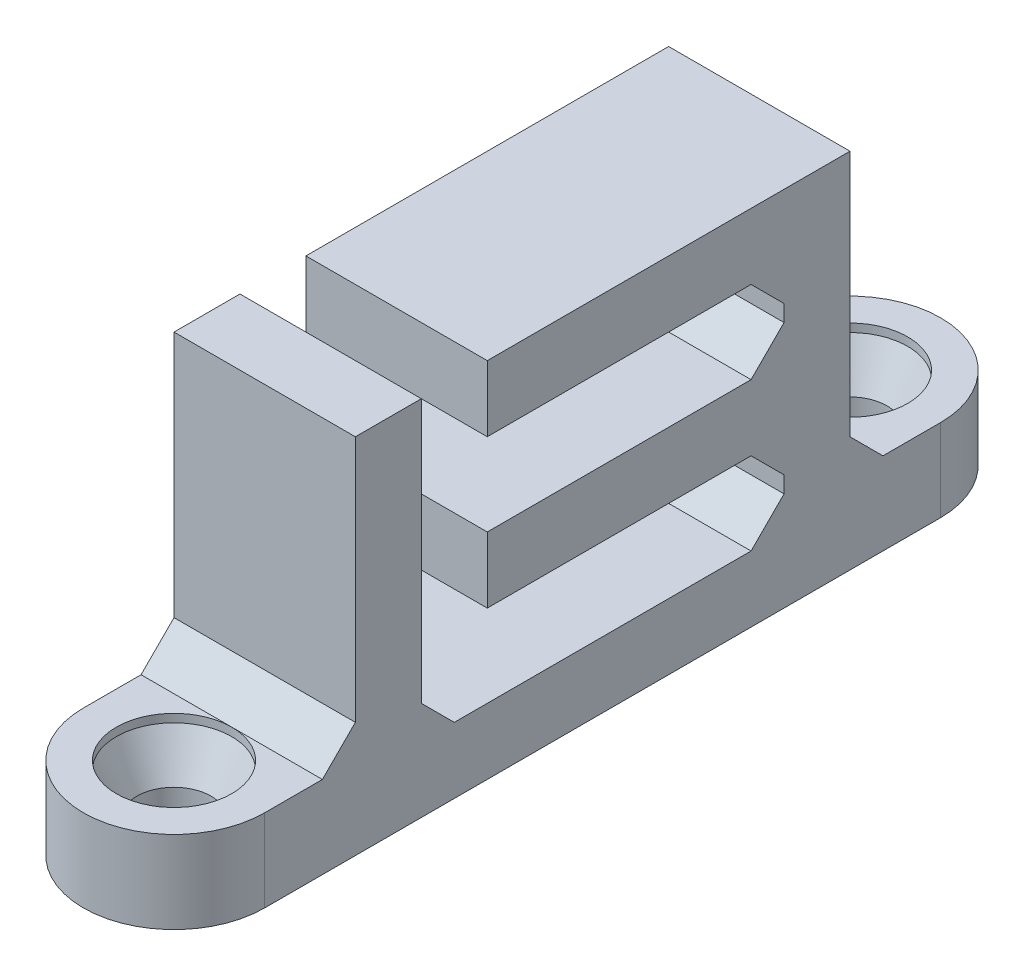
ISO-10303-21;
HEADER;
FILE_DESCRIPTION(('STEP AP214'),'2;1');
FILE_NAME('part.step','',(''),(''),'','','');
FILE_SCHEMA(('AUTOMOTIVE_DESIGN { 1 0 10303 214 1 1 1 1 }'));
ENDSEC;
DATA;
#1=APPLICATION_CONTEXT('core data for automotive mechanical design processes');
#2=APPLICATION_PROTOCOL_DEFINITION('international standard','automotive_design',2000,#1);
#3=PRODUCT_CONTEXT('',#1,'mechanical');
#4=PRODUCT('Part','Part','',(#3));
#5=PRODUCT_RELATED_PRODUCT_CATEGORY('part','',(#4));
#6=PRODUCT_DEFINITION_FORMATION('','',#4);
#7=PRODUCT_DEFINITION_CONTEXT('part definition',#1,'design');
#8=PRODUCT_DEFINITION('design','',#6,#7);
#9=PRODUCT_DEFINITION_SHAPE('','',#8);
#10=(LENGTH_UNIT() NAMED_UNIT(*) SI_UNIT(.MILLI.,.METRE.));
#11=(NAMED_UNIT(*) PLANE_ANGLE_UNIT() SI_UNIT($,.RADIAN.));
#12=(NAMED_UNIT(*) SI_UNIT($,.STERADIAN.) SOLID_ANGLE_UNIT());
#13=UNCERTAINTY_MEASURE_WITH_UNIT(LENGTH_MEASURE(1.E-05),#10,'distance_accuracy_value','');
#14=(GEOMETRIC_REPRESENTATION_CONTEXT(3) GLOBAL_UNCERTAINTY_ASSIGNED_CONTEXT((#13)) GLOBAL_UNIT_ASSIGNED_CONTEXT((#10,
#11,#12)) REPRESENTATION_CONTEXT('',''));
#15=CARTESIAN_POINT('',(0.,0.,0.));
#16=DIRECTION('',(0.,0.,1.));
#17=DIRECTION('',(1.,0.,0.));
#18=AXIS2_PLACEMENT_3D('',#15,#16,#17);
#19=CARTESIAN_POINT('',(5.5,5.,5.5));
#20=DIRECTION('',(0.,-1.,0.));
#21=DIRECTION('',(0.,0.,-1.));
#22=AXIS2_PLACEMENT_3D('',#19,#20,#21);
#23=CYLINDRICAL_SURFACE('',#22,2.25);
#24=CARTESIAN_POINT('',(5.5,0.,5.5));
#25=DIRECTION('',(0.,1.,0.));
#26=DIRECTION('',(0.,0.,1.));
#27=AXIS2_PLACEMENT_3D('',#24,#25,#26);
#28=CIRCLE('',#27,2.25);
#29=CARTESIAN_POINT('',(5.5,0.,7.75));
#30=VERTEX_POINT('',#29);
#31=EDGE_CURVE('E411',#30,#30,#28,.T.);
#32=ORIENTED_EDGE('',*,*,#31,.F.);
#33=EDGE_LOOP('',(#32));
#34=FACE_BOUND('',#33,.T.);
#35=CARTESIAN_POINT('',(5.5,2.,5.5));
#36=DIRECTION('',(0.,1.,0.));
#37=DIRECTION('',(0.,0.,1.));
#38=AXIS2_PLACEMENT_3D('',#35,#36,#37);
#39=CIRCLE('',#38,2.25);
#40=CARTESIAN_POINT('',(5.5,2.,7.75));
#41=VERTEX_POINT('',#40);
#42=EDGE_CURVE('E271',#41,#41,#39,.T.);
#43=ORIENTED_EDGE('',*,*,#42,.T.);
#44=EDGE_LOOP('',(#43));
#45=FACE_BOUND('',#44,.T.);
#46=ADVANCED_FACE('F37',(#34,#45),#23,.F.);
#47=CARTESIAN_POINT('',(5.5,5.,-35.5));
#48=DIRECTION('',(0.,-1.,0.));
#49=DIRECTION('',(0.,0.,-1.));
#50=AXIS2_PLACEMENT_3D('',#47,#48,#49);
#51=CYLINDRICAL_SURFACE('',#50,2.25);
#52=CARTESIAN_POINT('',(5.5,0.,-35.5));
#53=DIRECTION('',(0.,1.,0.));
#54=DIRECTION('',(0.,0.,1.));
#55=AXIS2_PLACEMENT_3D('',#52,#53,#54);
#56=CIRCLE('',#55,2.25);
#57=CARTESIAN_POINT('',(5.5,0.,-33.25));
#58=VERTEX_POINT('',#57);
#59=EDGE_CURVE('E275',#58,#58,#56,.T.);
#60=ORIENTED_EDGE('',*,*,#59,.F.);
#61=EDGE_LOOP('',(#60));
#62=FACE_BOUND('',#61,.T.);
#63=CARTESIAN_POINT('',(5.5,2.,-35.5));
#64=DIRECTION('',(0.,1.,0.));
#65=DIRECTION('',(0.,0.,1.));
#66=AXIS2_PLACEMENT_3D('',#63,#64,#65);
#67=CIRCLE('',#66,2.25);
#68=CARTESIAN_POINT('',(5.5,2.,-33.25));
#69=VERTEX_POINT('',#68);
#70=EDGE_CURVE('E268',#69,#69,#67,.T.);
#71=ORIENTED_EDGE('',*,*,#70,.T.);
#72=EDGE_LOOP('',(#71));
#73=FACE_BOUND('',#72,.T.);
#74=ADVANCED_FACE('F503',(#62,#73),#51,.F.);
#75=CARTESIAN_POINT('',(11.,0.,-30.));
#76=DIRECTION('',(0.,0.,1.));
#77=DIRECTION('',(1.,0.,0.));
#78=AXIS2_PLACEMENT_3D('',#75,#76,#77);
#79=PLANE('',#78);
#80=DIRECTION('',(0.,1.,0.));
#81=VECTOR('',#80,1.);
#82=CARTESIAN_POINT('',(0.,0.,-30.));
#83=LINE('',#82,#81);
#84=CARTESIAN_POINT('',(0.,7.,-30.));
#85=VERTEX_POINT('',#84);
#86=CARTESIAN_POINT('',(0.,22.,-30.));
#87=VERTEX_POINT('',#86);
#88=EDGE_CURVE('E216',#85,#87,#83,.T.);
#89=ORIENTED_EDGE('',*,*,#88,.T.);
#90=DIRECTION('',(1.,0.,0.));
#91=VECTOR('',#90,1.);
#92=CARTESIAN_POINT('',(11.,22.,-30.));
#93=LINE('',#92,#91);
#94=CARTESIAN_POINT('',(11.,22.,-30.));
#95=VERTEX_POINT('',#94);
#96=EDGE_CURVE('E226',#87,#95,#93,.T.);
#97=ORIENTED_EDGE('',*,*,#96,.T.);
#98=DIRECTION('',(0.,1.,0.));
#99=VECTOR('',#98,1.);
#100=CARTESIAN_POINT('',(11.,0.,-30.));
#101=LINE('',#100,#99);
#102=CARTESIAN_POINT('',(11.,7.,-30.));
#103=VERTEX_POINT('',#102);
#104=EDGE_CURVE('E381',#103,#95,#101,.T.);
#105=ORIENTED_EDGE('',*,*,#104,.F.);
#106=DIRECTION('',(-1.,0.,0.));
#107=VECTOR('',#106,1.);
#108=CARTESIAN_POINT('',(11.,7.,-30.));
#109=LINE('',#108,#107);
#110=EDGE_CURVE('E237',#103,#85,#109,.T.);
#111=ORIENTED_EDGE('',*,*,#110,.T.);
#112=EDGE_LOOP('',(#89,#97,#105,#111));
#113=FACE_BOUND('',#112,.T.);
#114=ADVANCED_FACE('F235',(#113),#79,.F.);
#115=CARTESIAN_POINT('',(11.,9.,0.));
#116=DIRECTION('',(0.,1.,0.));
#117=DIRECTION('',(0.,0.,1.));
#118=AXIS2_PLACEMENT_3D('',#115,#116,#117);
#119=PLANE('',#118);
#120=DIRECTION('',(0.,0.,-1.));
#121=VECTOR('',#120,1.);
#122=CARTESIAN_POINT('',(0.,9.,0.));
#123=LINE('',#122,#121);
#124=CARTESIAN_POINT('',(0.,9.,-8.));
#125=VERTEX_POINT('',#124);
#126=CARTESIAN_POINT('',(0.,9.,-24.));
#127=VERTEX_POINT('',#126);
#128=EDGE_CURVE('E253',#125,#127,#123,.T.);
#129=ORIENTED_EDGE('',*,*,#128,.T.);
#130=DIRECTION('',(1.,0.,0.));
#131=VECTOR('',#130,1.);
#132=CARTESIAN_POINT('',(11.,9.,-24.));
#133=LINE('',#132,#131);
#134=CARTESIAN_POINT('',(11.,9.,-24.));
#135=VERTEX_POINT('',#134);
#136=EDGE_CURVE('E307',#127,#135,#133,.T.);
#137=ORIENTED_EDGE('',*,*,#136,.T.);
#138=DIRECTION('',(0.,0.,-1.));
#139=VECTOR('',#138,1.);
#140=CARTESIAN_POINT('',(11.,9.,0.));
#141=LINE('',#140,#139);
#142=CARTESIAN_POINT('',(11.,9.,-8.));
#143=VERTEX_POINT('',#142);
#144=EDGE_CURVE('E363',#143,#135,#141,.T.);
#145=ORIENTED_EDGE('',*,*,#144,.F.);
#146=DIRECTION('',(-1.,0.,0.));
#147=VECTOR('',#146,1.);
#148=CARTESIAN_POINT('',(11.,9.,-8.));
#149=LINE('',#148,#147);
#150=EDGE_CURVE('E223',#143,#125,#149,.T.);
#151=ORIENTED_EDGE('',*,*,#150,.T.);
#152=EDGE_LOOP('',(#129,#137,#145,#151));
#153=FACE_BOUND('',#152,.T.);
#154=ADVANCED_FACE('F536',(#153),#119,.F.);
#155=CARTESIAN_POINT('',(11.,0.,-26.));
#156=DIRECTION('',(0.,0.,1.));
#157=DIRECTION('',(0.,-1.,0.));
#158=AXIS2_PLACEMENT_3D('',#155,#156,#157);
#159=PLANE('',#158);
#160=DIRECTION('',(0.,1.,0.));
#161=VECTOR('',#160,1.);
#162=CARTESIAN_POINT('',(11.,0.,-26.));
#163=LINE('',#162,#161);
#164=CARTESIAN_POINT('',(11.,5.99999999999999,-26.));
#165=VERTEX_POINT('',#164);
#166=CARTESIAN_POINT('',(11.,7.,-26.));
#167=VERTEX_POINT('',#166);
#168=EDGE_CURVE('E359',#165,#167,#163,.T.);
#169=ORIENTED_EDGE('',*,*,#168,.T.);
#170=DIRECTION('',(-1.,0.,0.));
#171=VECTOR('',#170,1.);
#172=CARTESIAN_POINT('',(11.,7.,-26.));
#173=LINE('',#172,#171);
#174=CARTESIAN_POINT('',(0.,7.,-26.));
#175=VERTEX_POINT('',#174);
#176=EDGE_CURVE('E304',#167,#175,#173,.T.);
#177=ORIENTED_EDGE('',*,*,#176,.T.);
#178=DIRECTION('',(0.,1.,0.));
#179=VECTOR('',#178,1.);
#180=CARTESIAN_POINT('',(0.,0.,-26.));
#181=LINE('',#180,#179);
#182=CARTESIAN_POINT('',(0.,5.99999999999999,-26.));
#183=VERTEX_POINT('',#182);
#184=EDGE_CURVE('E256',#183,#175,#181,.T.);
#185=ORIENTED_EDGE('',*,*,#184,.F.);
#186=DIRECTION('',(1.,0.,0.));
#187=VECTOR('',#186,1.);
#188=CARTESIAN_POINT('',(11.,5.99999999999999,-26.));
#189=LINE('',#188,#187);
#190=EDGE_CURVE('E302',#183,#165,#189,.T.);
#191=ORIENTED_EDGE('',*,*,#190,.T.);
#192=EDGE_LOOP('',(#169,#177,#185,#191));
#193=FACE_BOUND('',#192,.T.);
#194=ADVANCED_FACE('F349',(#193),#159,.T.);
#195=CARTESIAN_POINT('',(11.,4.,0.));
#196=DIRECTION('',(0.,1.,0.));
#197=DIRECTION('',(0.,0.,1.));
#198=AXIS2_PLACEMENT_3D('',#195,#196,#197);
#199=PLANE('',#198);
#200=DIRECTION('',(0.,0.,-1.));
#201=VECTOR('',#200,1.);
#202=CARTESIAN_POINT('',(0.,4.,0.));
#203=LINE('',#202,#201);
#204=CARTESIAN_POINT('',(0.,4.,-6.));
#205=VERTEX_POINT('',#204);
#206=CARTESIAN_POINT('',(0.,4.,-24.));
#207=VERTEX_POINT('',#206);
#208=EDGE_CURVE('E259',#205,#207,#203,.T.);
#209=ORIENTED_EDGE('',*,*,#208,.F.);
#210=DIRECTION('',(1.,0.,0.));
#211=VECTOR('',#210,1.);
#212=CARTESIAN_POINT('',(11.,4.,-6.));
#213=LINE('',#212,#211);
#214=CARTESIAN_POINT('',(11.,4.,-6.));
#215=VERTEX_POINT('',#214);
#216=EDGE_CURVE('E287',#205,#215,#213,.T.);
#217=ORIENTED_EDGE('',*,*,#216,.T.);
#218=DIRECTION('',(0.,0.,-1.));
#219=VECTOR('',#218,1.);
#220=CARTESIAN_POINT('',(11.,4.,0.));
#221=LINE('',#220,#219);
#222=CARTESIAN_POINT('',(11.,4.,-24.));
#223=VERTEX_POINT('',#222);
#224=EDGE_CURVE('E357',#215,#223,#221,.T.);
#225=ORIENTED_EDGE('',*,*,#224,.T.);
#226=DIRECTION('',(-1.,0.,0.));
#227=VECTOR('',#226,1.);
#228=CARTESIAN_POINT('',(0.,4.,-24.));
#229=LINE('',#228,#227);
#230=EDGE_CURVE('E284',#223,#207,#229,.T.);
#231=ORIENTED_EDGE('',*,*,#230,.T.);
#232=EDGE_LOOP('',(#209,#217,#225,#231));
#233=FACE_BOUND('',#232,.T.);
#234=ADVANCED_FACE('F361',(#233),#199,.T.);
#235=CARTESIAN_POINT('',(11.,18.,0.));
#236=DIRECTION('',(0.,1.,0.));
#237=DIRECTION('',(0.,0.,1.));
#238=AXIS2_PLACEMENT_3D('',#235,#236,#237);
#239=PLANE('',#238);
#240=DIRECTION('',(0.,0.,-1.));
#241=VECTOR('',#240,1.);
#242=CARTESIAN_POINT('',(0.,18.,0.));
#243=LINE('',#242,#241);
#244=CARTESIAN_POINT('',(0.,18.,-8.));
#245=VERTEX_POINT('',#244);
#246=CARTESIAN_POINT('',(0.,18.,-24.));
#247=VERTEX_POINT('',#246);
#248=EDGE_CURVE('E245',#245,#247,#243,.T.);
#249=ORIENTED_EDGE('',*,*,#248,.T.);
#250=DIRECTION('',(1.,0.,0.));
#251=VECTOR('',#250,1.);
#252=CARTESIAN_POINT('',(11.,18.,-24.));
#253=LINE('',#252,#251);
#254=CARTESIAN_POINT('',(11.,18.,-24.));
#255=VERTEX_POINT('',#254);
#256=EDGE_CURVE('E314',#247,#255,#253,.T.);
#257=ORIENTED_EDGE('',*,*,#256,.T.);
#258=DIRECTION('',(0.,0.,-1.));
#259=VECTOR('',#258,1.);
#260=CARTESIAN_POINT('',(11.,18.,0.));
#261=LINE('',#260,#259);
#262=CARTESIAN_POINT('',(11.,18.,-8.));
#263=VERTEX_POINT('',#262);
#264=EDGE_CURVE('E373',#263,#255,#261,.T.);
#265=ORIENTED_EDGE('',*,*,#264,.F.);
#266=DIRECTION('',(-1.,0.,0.));
#267=VECTOR('',#266,1.);
#268=CARTESIAN_POINT('',(11.,18.,-8.));
#269=LINE('',#268,#267);
#270=EDGE_CURVE('E388',#263,#245,#269,.T.);
#271=ORIENTED_EDGE('',*,*,#270,.T.);
#272=EDGE_LOOP('',(#249,#257,#265,#271));
#273=FACE_BOUND('',#272,.T.);
#274=ADVANCED_FACE('F533',(#273),#239,.F.);
#275=CARTESIAN_POINT('',(11.,0.,-26.));
#276=DIRECTION('',(0.,0.,1.));
#277=DIRECTION('',(0.,-1.,0.));
#278=AXIS2_PLACEMENT_3D('',#275,#276,#277);
#279=PLANE('',#278);
#280=DIRECTION('',(0.,1.,0.));
#281=VECTOR('',#280,1.);
#282=CARTESIAN_POINT('',(11.,0.,-26.));
#283=LINE('',#282,#281);
#284=CARTESIAN_POINT('',(11.,15.,-26.));
#285=VERTEX_POINT('',#284);
#286=CARTESIAN_POINT('',(11.,16.,-26.));
#287=VERTEX_POINT('',#286);
#288=EDGE_CURVE('E370',#285,#287,#283,.T.);
#289=ORIENTED_EDGE('',*,*,#288,.T.);
#290=DIRECTION('',(-1.,0.,0.));
#291=VECTOR('',#290,1.);
#292=CARTESIAN_POINT('',(11.,16.,-26.));
#293=LINE('',#292,#291);
#294=CARTESIAN_POINT('',(0.,16.,-26.));
#295=VERTEX_POINT('',#294);
#296=EDGE_CURVE('E311',#287,#295,#293,.T.);
#297=ORIENTED_EDGE('',*,*,#296,.T.);
#298=DIRECTION('',(0.,1.,0.));
#299=VECTOR('',#298,1.);
#300=CARTESIAN_POINT('',(0.,0.,-26.));
#301=LINE('',#300,#299);
#302=CARTESIAN_POINT('',(0.,15.,-26.));
#303=VERTEX_POINT('',#302);
#304=EDGE_CURVE('E248',#303,#295,#301,.T.);
#305=ORIENTED_EDGE('',*,*,#304,.F.);
#306=DIRECTION('',(1.,0.,0.));
#307=VECTOR('',#306,1.);
#308=CARTESIAN_POINT('',(11.,15.,-26.));
#309=LINE('',#308,#307);
#310=EDGE_CURVE('E309',#303,#285,#309,.T.);
#311=ORIENTED_EDGE('',*,*,#310,.T.);
#312=EDGE_LOOP('',(#289,#297,#305,#311));
#313=FACE_BOUND('',#312,.T.);
#314=ADVANCED_FACE('F543',(#313),#279,.T.);
#315=CARTESIAN_POINT('',(11.,13.,0.));
#316=DIRECTION('',(0.,-1.,0.));
#317=DIRECTION('',(0.,0.,-1.));
#318=AXIS2_PLACEMENT_3D('',#315,#316,#317);
#319=PLANE('',#318);
#320=DIRECTION('',(0.,0.,1.));
#321=VECTOR('',#320,1.);
#322=CARTESIAN_POINT('',(11.,13.,0.));
#323=LINE('',#322,#321);
#324=CARTESIAN_POINT('',(11.,13.,-24.));
#325=VERTEX_POINT('',#324);
#326=CARTESIAN_POINT('',(11.,13.,-8.));
#327=VERTEX_POINT('',#326);
#328=EDGE_CURVE('E368',#325,#327,#323,.T.);
#329=ORIENTED_EDGE('',*,*,#328,.F.);
#330=DIRECTION('',(-1.,0.,0.));
#331=VECTOR('',#330,1.);
#332=CARTESIAN_POINT('',(11.,13.,-24.));
#333=LINE('',#332,#331);
#334=CARTESIAN_POINT('',(0.,13.,-24.));
#335=VERTEX_POINT('',#334);
#336=EDGE_CURVE('E316',#325,#335,#333,.T.);
#337=ORIENTED_EDGE('',*,*,#336,.T.);
#338=DIRECTION('',(0.,0.,1.));
#339=VECTOR('',#338,1.);
#340=CARTESIAN_POINT('',(0.,13.,0.));
#341=LINE('',#340,#339);
#342=CARTESIAN_POINT('',(0.,13.,-8.));
#343=VERTEX_POINT('',#342);
#344=EDGE_CURVE('E251',#335,#343,#341,.T.);
#345=ORIENTED_EDGE('',*,*,#344,.T.);
#346=DIRECTION('',(1.,0.,0.));
#347=VECTOR('',#346,1.);
#348=CARTESIAN_POINT('',(11.,13.,-8.));
#349=LINE('',#348,#347);
#350=EDGE_CURVE('E391',#343,#327,#349,.T.);
#351=ORIENTED_EDGE('',*,*,#350,.T.);
#352=EDGE_LOOP('',(#329,#337,#345,#351));
#353=FACE_BOUND('',#352,.T.);
#354=ADVANCED_FACE('F540',(#353),#319,.F.);
#355=CARTESIAN_POINT('',(11.,0.,0.));
#356=DIRECTION('',(0.,0.,1.));
#357=DIRECTION('',(0.,-1.,0.));
#358=AXIS2_PLACEMENT_3D('',#355,#356,#357);
#359=PLANE('',#358);
#360=DIRECTION('',(1.,0.,0.));
#361=VECTOR('',#360,1.);
#362=CARTESIAN_POINT('',(11.,22.,0.));
#363=LINE('',#362,#361);
#364=CARTESIAN_POINT('',(0.,22.,0.));
#365=VERTEX_POINT('',#364);
#366=CARTESIAN_POINT('',(11.,22.,0.));
#367=VERTEX_POINT('',#366);
#368=EDGE_CURVE('E233',#365,#367,#363,.T.);
#369=ORIENTED_EDGE('',*,*,#368,.F.);
#370=DIRECTION('',(0.,1.,0.));
#371=VECTOR('',#370,1.);
#372=CARTESIAN_POINT('',(0.,0.,0.));
#373=LINE('',#372,#371);
#374=CARTESIAN_POINT('',(0.,6.99999999999999,0.));
#375=VERTEX_POINT('',#374);
#376=EDGE_CURVE('E238',#375,#365,#373,.T.);
#377=ORIENTED_EDGE('',*,*,#376,.F.);
#378=DIRECTION('',(1.,0.,0.));
#379=VECTOR('',#378,1.);
#380=CARTESIAN_POINT('',(11.,6.99999999999999,0.));
#381=LINE('',#380,#379);
#382=CARTESIAN_POINT('',(11.,6.99999999999999,0.));
#383=VERTEX_POINT('',#382);
#384=EDGE_CURVE('E294',#375,#383,#381,.T.);
#385=ORIENTED_EDGE('',*,*,#384,.T.);
#386=DIRECTION('',(0.,1.,0.));
#387=VECTOR('',#386,1.);
#388=CARTESIAN_POINT('',(11.,0.,0.));
#389=LINE('',#388,#387);
#390=EDGE_CURVE('E378',#383,#367,#389,.T.);
#391=ORIENTED_EDGE('',*,*,#390,.T.);
#392=EDGE_LOOP('',(#369,#377,#385,#391));
#393=FACE_BOUND('',#392,.T.);
#394=ADVANCED_FACE('F452',(#393),#359,.T.);
#395=CARTESIAN_POINT('',(11.,22.,0.));
#396=DIRECTION('',(0.,-1.,0.));
#397=DIRECTION('',(0.,0.,-1.));
#398=AXIS2_PLACEMENT_3D('',#395,#396,#397);
#399=PLANE('',#398);
#400=DIRECTION('',(0.,0.,1.));
#401=VECTOR('',#400,1.);
#402=CARTESIAN_POINT('',(11.,22.,0.));
#403=LINE('',#402,#401);
#404=CARTESIAN_POINT('',(11.,22.,-8.));
#405=VERTEX_POINT('',#404);
#406=EDGE_CURVE('E228',#95,#405,#403,.T.);
#407=ORIENTED_EDGE('',*,*,#406,.F.);
#408=ORIENTED_EDGE('',*,*,#96,.F.);
#409=DIRECTION('',(0.,0.,1.));
#410=VECTOR('',#409,1.);
#411=CARTESIAN_POINT('',(0.,22.,0.));
#412=LINE('',#411,#410);
#413=CARTESIAN_POINT('',(0.,22.,-8.));
#414=VERTEX_POINT('',#413);
#415=EDGE_CURVE('E211',#87,#414,#412,.T.);
#416=ORIENTED_EDGE('',*,*,#415,.T.);
#417=DIRECTION('',(1.,0.,0.));
#418=VECTOR('',#417,1.);
#419=CARTESIAN_POINT('',(11.,22.,-8.));
#420=LINE('',#419,#418);
#421=EDGE_CURVE('E394',#414,#405,#420,.T.);
#422=ORIENTED_EDGE('',*,*,#421,.T.);
#423=EDGE_LOOP('',(#407,#408,#416,#422));
#424=FACE_BOUND('',#423,.T.);
#425=ADVANCED_FACE('F227',(#424),#399,.F.);
#426=CARTESIAN_POINT('',(11.,0.,0.));
#427=DIRECTION('',(0.,1.,0.));
#428=DIRECTION('',(0.,0.,1.));
#429=AXIS2_PLACEMENT_3D('',#426,#427,#428);
#430=PLANE('',#429);
#431=DIRECTION('',(0.,0.,-1.));
#432=VECTOR('',#431,1.);
#433=CARTESIAN_POINT('',(0.,0.,0.));
#434=LINE('',#433,#432);
#435=CARTESIAN_POINT('',(0.,0.,5.5));
#436=VERTEX_POINT('',#435);
#437=CARTESIAN_POINT('',(0.,0.,-35.5));
#438=VERTEX_POINT('',#437);
#439=EDGE_CURVE('E240',#436,#438,#434,.T.);
#440=ORIENTED_EDGE('',*,*,#439,.T.);
#441=CARTESIAN_POINT('',(5.5,0.,-35.5));
#442=DIRECTION('',(0.,1.,0.));
#443=DIRECTION('',(0.,0.,1.));
#444=AXIS2_PLACEMENT_3D('',#441,#442,#443);
#445=CIRCLE('',#444,5.5);
#446=CARTESIAN_POINT('',(11.,0.,-35.5));
#447=VERTEX_POINT('',#446);
#448=EDGE_CURVE('E426',#447,#438,#445,.T.);
#449=ORIENTED_EDGE('',*,*,#448,.F.);
#450=DIRECTION('',(0.,0.,-1.));
#451=VECTOR('',#450,1.);
#452=CARTESIAN_POINT('',(11.,0.,0.));
#453=LINE('',#452,#451);
#454=CARTESIAN_POINT('',(11.,0.,5.5));
#455=VERTEX_POINT('',#454);
#456=EDGE_CURVE('E376',#455,#447,#453,.T.);
#457=ORIENTED_EDGE('',*,*,#456,.F.);
#458=CARTESIAN_POINT('',(5.5,0.,5.5));
#459=DIRECTION('',(0.,1.,0.));
#460=DIRECTION('',(0.,0.,1.));
#461=AXIS2_PLACEMENT_3D('',#458,#459,#460);
#462=CIRCLE('',#461,5.5);
#463=EDGE_CURVE('E407',#436,#455,#462,.T.);
#464=ORIENTED_EDGE('',*,*,#463,.F.);
#465=EDGE_LOOP('',(#440,#449,#457,#464));
#466=FACE_BOUND('',#465,.T.);
#467=ORIENTED_EDGE('',*,*,#31,.T.);
#468=EDGE_LOOP('',(#467));
#469=FACE_BOUND('',#468,.T.);
#470=ORIENTED_EDGE('',*,*,#59,.T.);
#471=EDGE_LOOP('',(#470));
#472=FACE_BOUND('',#471,.T.);
#473=ADVANCED_FACE('F478',(#466,#469,#472),#430,.F.);
#474=CARTESIAN_POINT('',(11.,0.,-4.00000000000001));
#475=DIRECTION('',(0.,0.,-1.));
#476=DIRECTION('',(0.,1.,0.));
#477=AXIS2_PLACEMENT_3D('',#474,#475,#476);
#478=PLANE('',#477);
#479=DIRECTION('',(-1.,0.,0.));
#480=VECTOR('',#479,1.);
#481=CARTESIAN_POINT('',(11.,22.,-4.00000000000001));
#482=LINE('',#481,#480);
#483=CARTESIAN_POINT('',(11.,22.,-4.));
#484=VERTEX_POINT('',#483);
#485=CARTESIAN_POINT('',(0.,22.,-4.00000000000001));
#486=VERTEX_POINT('',#485);
#487=EDGE_CURVE('E53',#484,#486,#482,.T.);
#488=ORIENTED_EDGE('',*,*,#487,.F.);
#489=DIRECTION('',(0.,-1.,0.));
#490=VECTOR('',#489,1.);
#491=CARTESIAN_POINT('',(11.,0.,-4.00000000000001));
#492=LINE('',#491,#490);
#493=CARTESIAN_POINT('',(11.,6.00000000000002,-4.00000000000001));
#494=VERTEX_POINT('',#493);
#495=EDGE_CURVE('E383',#484,#494,#492,.T.);
#496=ORIENTED_EDGE('',*,*,#495,.T.);
#497=DIRECTION('',(-1.,0.,0.));
#498=VECTOR('',#497,1.);
#499=CARTESIAN_POINT('',(0.,6.00000000000002,-4.00000000000001));
#500=LINE('',#499,#498);
#501=CARTESIAN_POINT('',(0.,6.00000000000002,-4.00000000000001));
#502=VERTEX_POINT('',#501);
#503=EDGE_CURVE('E281',#494,#502,#500,.T.);
#504=ORIENTED_EDGE('',*,*,#503,.T.);
#505=DIRECTION('',(0.,-1.,0.));
#506=VECTOR('',#505,1.);
#507=CARTESIAN_POINT('',(0.,0.,-4.00000000000001));
#508=LINE('',#507,#506);
#509=EDGE_CURVE('E262',#486,#502,#508,.T.);
#510=ORIENTED_EDGE('',*,*,#509,.F.);
#511=EDGE_LOOP('',(#488,#496,#504,#510));
#512=FACE_BOUND('',#511,.T.);
#513=ADVANCED_FACE('F525',(#512),#478,.T.);
#514=CARTESIAN_POINT('',(11.,0.,0.));
#515=DIRECTION('',(1.,0.,0.));
#516=DIRECTION('',(0.,0.,-1.));
#517=AXIS2_PLACEMENT_3D('',#514,#515,#516);
#518=PLANE('',#517);
#519=DIRECTION('',(0.,0.,1.));
#520=VECTOR('',#519,1.);
#521=CARTESIAN_POINT('',(11.,22.,-33.9659140243555));
#522=LINE('',#521,#520);
#523=EDGE_CURVE('E444',#484,#367,#522,.T.);
#524=ORIENTED_EDGE('',*,*,#523,.T.);
#525=ORIENTED_EDGE('',*,*,#390,.F.);
#526=DIRECTION('',(0.,0.707106781186543,-0.707106781186552));
#527=VECTOR('',#526,1.);
#528=CARTESIAN_POINT('',(11.,5.,2.00000000000002));
#529=LINE('',#528,#527);
#530=CARTESIAN_POINT('',(11.,5.,2.00000000000002));
#531=VERTEX_POINT('',#530);
#532=EDGE_CURVE('E326',#383,#531,#529,.F.);
#533=ORIENTED_EDGE('',*,*,#532,.T.);
#534=DIRECTION('',(0.,0.,-1.));
#535=VECTOR('',#534,1.);
#536=CARTESIAN_POINT('',(11.,5.,0.));
#537=LINE('',#536,#535);
#538=CARTESIAN_POINT('',(11.,5.,5.5));
#539=VERTEX_POINT('',#538);
#540=EDGE_CURVE('E406',#539,#531,#537,.T.);
#541=ORIENTED_EDGE('',*,*,#540,.F.);
#542=DIRECTION('',(0.,-1.,0.));
#543=VECTOR('',#542,1.);
#544=CARTESIAN_POINT('',(11.,5.,5.5));
#545=LINE('',#544,#543);
#546=EDGE_CURVE('E403',#539,#455,#545,.T.);
#547=ORIENTED_EDGE('',*,*,#546,.T.);
#548=ORIENTED_EDGE('',*,*,#456,.T.);
#549=DIRECTION('',(0.,-1.,0.));
#550=VECTOR('',#549,1.);
#551=CARTESIAN_POINT('',(11.,5.,-35.5));
#552=LINE('',#551,#550);
#553=CARTESIAN_POINT('',(11.,5.,-35.5));
#554=VERTEX_POINT('',#553);
#555=EDGE_CURVE('E422',#554,#447,#552,.T.);
#556=ORIENTED_EDGE('',*,*,#555,.F.);
#557=DIRECTION('',(0.,0.,-1.));
#558=VECTOR('',#557,1.);
#559=CARTESIAN_POINT('',(11.,5.,-35.5));
#560=LINE('',#559,#558);
#561=CARTESIAN_POINT('',(11.,5.,-32.));
#562=VERTEX_POINT('',#561);
#563=EDGE_CURVE('E425',#562,#554,#560,.T.);
#564=ORIENTED_EDGE('',*,*,#563,.F.);
#565=DIRECTION('',(0.,0.707106781186544,0.707106781186551));
#566=VECTOR('',#565,1.);
#567=CARTESIAN_POINT('',(11.,5.,-32.));
#568=LINE('',#567,#566);
#569=EDGE_CURVE('E328',#562,#103,#568,.T.);
#570=ORIENTED_EDGE('',*,*,#569,.T.);
#571=ORIENTED_EDGE('',*,*,#104,.T.);
#572=ORIENTED_EDGE('',*,*,#406,.T.);
#573=DIRECTION('',(0.,1.,0.));
#574=VECTOR('',#573,1.);
#575=CARTESIAN_POINT('',(11.,4.,-8.));
#576=LINE('',#575,#574);
#577=EDGE_CURVE('E397',#263,#405,#576,.T.);
#578=ORIENTED_EDGE('',*,*,#577,.F.);
#579=ORIENTED_EDGE('',*,*,#264,.T.);
#580=DIRECTION('',(0.,-0.707106781186551,-0.707106781186544));
#581=VECTOR('',#580,1.);
#582=CARTESIAN_POINT('',(11.,16.,-26.));
#583=LINE('',#582,#581);
#584=EDGE_CURVE('E338',#255,#287,#583,.T.);
#585=ORIENTED_EDGE('',*,*,#584,.T.);
#586=ORIENTED_EDGE('',*,*,#288,.F.);
#587=DIRECTION('',(0.,-0.707106781186545,0.70710678118655));
#588=VECTOR('',#587,1.);
#589=CARTESIAN_POINT('',(11.,13.,-24.));
#590=LINE('',#589,#588);
#591=EDGE_CURVE('E61',#285,#325,#590,.T.);
#592=ORIENTED_EDGE('',*,*,#591,.T.);
#593=ORIENTED_EDGE('',*,*,#328,.T.);
#594=EDGE_CURVE('E396',#143,#327,#576,.T.);
#595=ORIENTED_EDGE('',*,*,#594,.F.);
#596=ORIENTED_EDGE('',*,*,#144,.T.);
#597=DIRECTION('',(0.,-0.70710678118655,-0.707106781186545));
#598=VECTOR('',#597,1.);
#599=CARTESIAN_POINT('',(11.,7.,-26.));
#600=LINE('',#599,#598);
#601=EDGE_CURVE('E334',#135,#167,#600,.T.);
#602=ORIENTED_EDGE('',*,*,#601,.T.);
#603=ORIENTED_EDGE('',*,*,#168,.F.);
#604=DIRECTION('',(0.,0.707106781186545,-0.70710678118655));
#605=VECTOR('',#604,1.);
#606=CARTESIAN_POINT('',(11.,4.,-24.));
#607=LINE('',#606,#605);
#608=EDGE_CURVE('E11',#165,#223,#607,.F.);
#609=ORIENTED_EDGE('',*,*,#608,.T.);
#610=ORIENTED_EDGE('',*,*,#224,.F.);
#611=DIRECTION('',(0.,-0.707106781186551,-0.707106781186544));
#612=VECTOR('',#611,1.);
#613=CARTESIAN_POINT('',(11.,6.00000000000002,-4.00000000000001));
#614=LINE('',#613,#612);
#615=EDGE_CURVE('E321',#215,#494,#614,.F.);
#616=ORIENTED_EDGE('',*,*,#615,.T.);
#617=ORIENTED_EDGE('',*,*,#495,.F.);
#618=EDGE_LOOP('',(#524,#525,#533,#541,#547,#548,#556,#564,#570,#571,#572,#578,#579,#585,#586,
#592,#593,#595,#596,#602,#603,#609,#610,#616,#617));
#619=FACE_BOUND('',#618,.T.);
#620=ADVANCED_FACE('F356',(#619),#518,.T.);
#621=CARTESIAN_POINT('',(0.,0.,0.));
#622=DIRECTION('',(1.,0.,0.));
#623=DIRECTION('',(0.,0.,-1.));
#624=AXIS2_PLACEMENT_3D('',#621,#622,#623);
#625=PLANE('',#624);
#626=ORIENTED_EDGE('',*,*,#376,.T.);
#627=DIRECTION('',(0.,0.,1.));
#628=VECTOR('',#627,1.);
#629=CARTESIAN_POINT('',(0.,22.,-33.9659140243555));
#630=LINE('',#629,#628);
#631=EDGE_CURVE('E445',#486,#365,#630,.T.);
#632=ORIENTED_EDGE('',*,*,#631,.F.);
#633=ORIENTED_EDGE('',*,*,#509,.T.);
#634=DIRECTION('',(0.,0.707106781186551,0.707106781186544));
#635=VECTOR('',#634,1.);
#636=CARTESIAN_POINT('',(0.,4.99999999999998,-5.00000000000003));
#637=LINE('',#636,#635);
#638=EDGE_CURVE('E319',#502,#205,#637,.F.);
#639=ORIENTED_EDGE('',*,*,#638,.T.);
#640=ORIENTED_EDGE('',*,*,#208,.T.);
#641=DIRECTION('',(0.,-0.707106781186545,0.70710678118655));
#642=VECTOR('',#641,1.);
#643=CARTESIAN_POINT('',(0.,-9.99999999999998,-9.99999999999991));
#644=LINE('',#643,#642);
#645=EDGE_CURVE('E46',#207,#183,#644,.F.);
#646=ORIENTED_EDGE('',*,*,#645,.T.);
#647=ORIENTED_EDGE('',*,*,#184,.T.);
#648=DIRECTION('',(0.,0.70710678118655,0.707106781186545));
#649=VECTOR('',#648,1.);
#650=CARTESIAN_POINT('',(0.,16.5,-16.5000000000001));
#651=LINE('',#650,#649);
#652=EDGE_CURVE('E332',#175,#127,#651,.T.);
#653=ORIENTED_EDGE('',*,*,#652,.T.);
#654=ORIENTED_EDGE('',*,*,#128,.F.);
#655=DIRECTION('',(0.,1.,0.));
#656=VECTOR('',#655,1.);
#657=CARTESIAN_POINT('',(0.,0.,-8.));
#658=LINE('',#657,#656);
#659=EDGE_CURVE('E264',#125,#343,#658,.T.);
#660=ORIENTED_EDGE('',*,*,#659,.T.);
#661=ORIENTED_EDGE('',*,*,#344,.F.);
#662=DIRECTION('',(0.,0.707106781186545,-0.70710678118655));
#663=VECTOR('',#662,1.);
#664=CARTESIAN_POINT('',(0.,-5.49999999999996,-5.49999999999992));
#665=LINE('',#664,#663);
#666=EDGE_CURVE('E340',#335,#303,#665,.T.);
#667=ORIENTED_EDGE('',*,*,#666,.T.);
#668=ORIENTED_EDGE('',*,*,#304,.T.);
#669=DIRECTION('',(0.,0.707106781186551,0.707106781186544));
#670=VECTOR('',#669,1.);
#671=CARTESIAN_POINT('',(0.,20.9999999999999,-21.0000000000001));
#672=LINE('',#671,#670);
#673=EDGE_CURVE('E336',#295,#247,#672,.T.);
#674=ORIENTED_EDGE('',*,*,#673,.T.);
#675=ORIENTED_EDGE('',*,*,#248,.F.);
#676=EDGE_CURVE('E219',#245,#414,#658,.T.);
#677=ORIENTED_EDGE('',*,*,#676,.T.);
#678=ORIENTED_EDGE('',*,*,#415,.F.);
#679=ORIENTED_EDGE('',*,*,#88,.F.);
#680=DIRECTION('',(0.,-0.707106781186544,-0.707106781186551));
#681=VECTOR('',#680,1.);
#682=CARTESIAN_POINT('',(0.,18.5,-18.4999999999998));
#683=LINE('',#682,#681);
#684=CARTESIAN_POINT('',(0.,5.,-32.));
#685=VERTEX_POINT('',#684);
#686=EDGE_CURVE('E330',#85,#685,#683,.T.);
#687=ORIENTED_EDGE('',*,*,#686,.T.);
#688=DIRECTION('',(0.,0.,1.));
#689=VECTOR('',#688,1.);
#690=CARTESIAN_POINT('',(0.,5.,-30.));
#691=LINE('',#690,#689);
#692=CARTESIAN_POINT('',(0.,5.,-35.5));
#693=VERTEX_POINT('',#692);
#694=EDGE_CURVE('E431',#693,#685,#691,.T.);
#695=ORIENTED_EDGE('',*,*,#694,.F.);
#696=DIRECTION('',(0.,-1.,0.));
#697=VECTOR('',#696,1.);
#698=CARTESIAN_POINT('',(0.,5.,-35.5));
#699=LINE('',#698,#697);
#700=EDGE_CURVE('E419',#693,#438,#699,.T.);
#701=ORIENTED_EDGE('',*,*,#700,.T.);
#702=ORIENTED_EDGE('',*,*,#439,.F.);
#703=DIRECTION('',(0.,-1.,0.));
#704=VECTOR('',#703,1.);
#705=CARTESIAN_POINT('',(0.,5.,5.5));
#706=LINE('',#705,#704);
#707=CARTESIAN_POINT('',(0.,5.,5.5));
#708=VERTEX_POINT('',#707);
#709=EDGE_CURVE('E400',#708,#436,#706,.T.);
#710=ORIENTED_EDGE('',*,*,#709,.F.);
#711=DIRECTION('',(0.,0.,1.));
#712=VECTOR('',#711,1.);
#713=CARTESIAN_POINT('',(0.,5.,0.));
#714=LINE('',#713,#712);
#715=CARTESIAN_POINT('',(0.,5.,2.00000000000002));
#716=VERTEX_POINT('',#715);
#717=EDGE_CURVE('E410',#716,#708,#714,.T.);
#718=ORIENTED_EDGE('',*,*,#717,.F.);
#719=DIRECTION('',(0.,-0.707106781186543,0.707106781186552));
#720=VECTOR('',#719,1.);
#721=CARTESIAN_POINT('',(0.,3.50000000000004,3.49999999999999));
#722=LINE('',#721,#720);
#723=EDGE_CURVE('E324',#716,#375,#722,.F.);
#724=ORIENTED_EDGE('',*,*,#723,.T.);
#725=EDGE_LOOP('',(#626,#632,#633,#639,#640,#646,#647,#653,#654,#660,#661,#667,#668,#674,#675,
#677,#678,#679,#687,#695,#701,#702,#710,#718,#724));
#726=FACE_BOUND('',#725,.T.);
#727=ADVANCED_FACE('F214',(#726),#625,.F.);
#728=CARTESIAN_POINT('',(0.,4.,-8.));
#729=DIRECTION('',(0.,0.,-1.));
#730=DIRECTION('',(-1.,0.,0.));
#731=AXIS2_PLACEMENT_3D('',#728,#729,#730);
#732=PLANE('',#731);
#733=ORIENTED_EDGE('',*,*,#577,.T.);
#734=ORIENTED_EDGE('',*,*,#421,.F.);
#735=ORIENTED_EDGE('',*,*,#676,.F.);
#736=ORIENTED_EDGE('',*,*,#270,.F.);
#737=EDGE_LOOP('',(#733,#734,#735,#736));
#738=FACE_BOUND('',#737,.T.);
#739=ADVANCED_FACE('F521',(#738),#732,.F.);
#740=ORIENTED_EDGE('',*,*,#594,.T.);
#741=ORIENTED_EDGE('',*,*,#350,.F.);
#742=ORIENTED_EDGE('',*,*,#659,.F.);
#743=ORIENTED_EDGE('',*,*,#150,.F.);
#744=EDGE_LOOP('',(#740,#741,#742,#743));
#745=FACE_BOUND('',#744,.T.);
#746=ADVANCED_FACE('F516',(#745),#732,.F.);
#747=CARTESIAN_POINT('',(5.5,5.,5.5));
#748=DIRECTION('',(0.,1.,0.));
#749=DIRECTION('',(0.,0.,1.));
#750=AXIS2_PLACEMENT_3D('',#747,#748,#749);
#751=PLANE('',#750);
#752=ORIENTED_EDGE('',*,*,#540,.T.);
#753=DIRECTION('',(-1.,0.,0.));
#754=VECTOR('',#753,1.);
#755=CARTESIAN_POINT('',(0.,5.,2.00000000000002));
#756=LINE('',#755,#754);
#757=CARTESIAN_POINT('',(5.5,5.,2.00000000000002));
#758=VERTEX_POINT('',#757);
#759=EDGE_CURVE('E291',#531,#758,#756,.T.);
#760=ORIENTED_EDGE('',*,*,#759,.T.);
#761=CARTESIAN_POINT('',(5.5,5.,5.5));
#762=DIRECTION('',(0.,1.,0.));
#763=DIRECTION('',(0.,0.,1.));
#764=AXIS2_PLACEMENT_3D('',#761,#762,#763);
#765=CIRCLE('',#764,3.5);
#766=EDGE_CURVE('E272',#758,#758,#765,.T.);
#767=ORIENTED_EDGE('',*,*,#766,.F.);
#768=DIRECTION('',(-1.,0.,0.));
#769=VECTOR('',#768,1.);
#770=CARTESIAN_POINT('',(0.,5.,2.00000000000002));
#771=LINE('',#770,#769);
#772=EDGE_CURVE('E289',#758,#716,#771,.T.);
#773=ORIENTED_EDGE('',*,*,#772,.T.);
#774=ORIENTED_EDGE('',*,*,#717,.T.);
#775=CARTESIAN_POINT('',(5.5,5.,5.5));
#776=DIRECTION('',(0.,1.,0.));
#777=DIRECTION('',(0.,0.,1.));
#778=AXIS2_PLACEMENT_3D('',#775,#776,#777);
#779=CIRCLE('',#778,5.5);
#780=EDGE_CURVE('E414',#708,#539,#779,.T.);
#781=ORIENTED_EDGE('',*,*,#780,.T.);
#782=EDGE_LOOP('',(#752,#760,#767,#773,#774,#781));
#783=FACE_BOUND('',#782,.T.);
#784=ADVANCED_FACE('F461',(#783),#751,.T.);
#785=CARTESIAN_POINT('',(5.5,5.,5.5));
#786=DIRECTION('',(0.,-1.,0.));
#787=DIRECTION('',(0.,0.,-1.));
#788=AXIS2_PLACEMENT_3D('',#785,#786,#787);
#789=CYLINDRICAL_SURFACE('',#788,5.5);
#790=ORIENTED_EDGE('',*,*,#463,.T.);
#791=ORIENTED_EDGE('',*,*,#546,.F.);
#792=ORIENTED_EDGE('',*,*,#780,.F.);
#793=ORIENTED_EDGE('',*,*,#709,.T.);
#794=EDGE_LOOP('',(#790,#791,#792,#793));
#795=FACE_BOUND('',#794,.T.);
#796=ADVANCED_FACE('F468',(#795),#789,.T.);
#797=CARTESIAN_POINT('',(5.5,5.,-35.5));
#798=DIRECTION('',(0.,1.,0.));
#799=DIRECTION('',(0.,0.,1.));
#800=AXIS2_PLACEMENT_3D('',#797,#798,#799);
#801=PLANE('',#800);
#802=ORIENTED_EDGE('',*,*,#694,.T.);
#803=DIRECTION('',(1.,0.,0.));
#804=VECTOR('',#803,1.);
#805=CARTESIAN_POINT('',(5.5,5.,-32.));
#806=LINE('',#805,#804);
#807=CARTESIAN_POINT('',(5.5,5.,-32.));
#808=VERTEX_POINT('',#807);
#809=EDGE_CURVE('E298',#685,#808,#806,.T.);
#810=ORIENTED_EDGE('',*,*,#809,.T.);
#811=CARTESIAN_POINT('',(5.5,5.,-35.5));
#812=DIRECTION('',(0.,1.,0.));
#813=DIRECTION('',(0.,0.,1.));
#814=AXIS2_PLACEMENT_3D('',#811,#812,#813);
#815=CIRCLE('',#814,3.5);
#816=EDGE_CURVE('E232',#808,#808,#815,.T.);
#817=ORIENTED_EDGE('',*,*,#816,.F.);
#818=DIRECTION('',(1.,0.,0.));
#819=VECTOR('',#818,1.);
#820=CARTESIAN_POINT('',(5.5,5.,-32.));
#821=LINE('',#820,#819);
#822=EDGE_CURVE('E296',#808,#562,#821,.T.);
#823=ORIENTED_EDGE('',*,*,#822,.T.);
#824=ORIENTED_EDGE('',*,*,#563,.T.);
#825=CARTESIAN_POINT('',(5.5,5.,-35.5));
#826=DIRECTION('',(0.,1.,0.));
#827=DIRECTION('',(0.,0.,1.));
#828=AXIS2_PLACEMENT_3D('',#825,#826,#827);
#829=CIRCLE('',#828,5.5);
#830=EDGE_CURVE('E429',#554,#693,#829,.T.);
#831=ORIENTED_EDGE('',*,*,#830,.T.);
#832=EDGE_LOOP('',(#802,#810,#817,#823,#824,#831));
#833=FACE_BOUND('',#832,.T.);
#834=ADVANCED_FACE('F482',(#833),#801,.T.);
#835=CARTESIAN_POINT('',(5.5,5.,-35.5));
#836=DIRECTION('',(0.,-1.,0.));
#837=DIRECTION('',(0.,0.,-1.));
#838=AXIS2_PLACEMENT_3D('',#835,#836,#837);
#839=CYLINDRICAL_SURFACE('',#838,5.5);
#840=ORIENTED_EDGE('',*,*,#448,.T.);
#841=ORIENTED_EDGE('',*,*,#700,.F.);
#842=ORIENTED_EDGE('',*,*,#830,.F.);
#843=ORIENTED_EDGE('',*,*,#555,.T.);
#844=EDGE_LOOP('',(#840,#841,#842,#843));
#845=FACE_BOUND('',#844,.T.);
#846=ADVANCED_FACE('F476',(#845),#839,.T.);
#847=CARTESIAN_POINT('',(5.5,2.,-35.5));
#848=DIRECTION('',(0.,1.,0.));
#849=DIRECTION('',(0.,0.,1.));
#850=AXIS2_PLACEMENT_3D('',#847,#848,#849);
#851=CYLINDRICAL_SURFACE('',#850,3.5);
#852=CARTESIAN_POINT('',(5.5,4.49999999999997,-35.5));
#853=DIRECTION('',(0.,1.,0.));
#854=DIRECTION('',(0.,0.,1.));
#855=AXIS2_PLACEMENT_3D('',#852,#853,#854);
#856=CIRCLE('',#855,3.5);
#857=CARTESIAN_POINT('',(5.5,4.49999999999997,-32.));
#858=VERTEX_POINT('',#857);
#859=EDGE_CURVE('E267',#858,#858,#856,.F.);
#860=ORIENTED_EDGE('',*,*,#859,.T.);
#861=EDGE_LOOP('',(#860));
#862=FACE_BOUND('',#861,.T.);
#863=ORIENTED_EDGE('',*,*,#816,.T.);
#864=EDGE_LOOP('',(#863));
#865=FACE_BOUND('',#864,.T.);
#866=ADVANCED_FACE('F488',(#862,#865),#851,.F.);
#867=CARTESIAN_POINT('',(5.5,2.,5.5));
#868=DIRECTION('',(0.,1.,0.));
#869=DIRECTION('',(0.,0.,1.));
#870=AXIS2_PLACEMENT_3D('',#867,#868,#869);
#871=CYLINDRICAL_SURFACE('',#870,3.5);
#872=CARTESIAN_POINT('',(5.5,4.49999999999995,5.5));
#873=DIRECTION('',(0.,1.,0.));
#874=DIRECTION('',(0.,0.,1.));
#875=AXIS2_PLACEMENT_3D('',#872,#873,#874);
#876=CIRCLE('',#875,3.5);
#877=CARTESIAN_POINT('',(5.5,4.49999999999995,9.));
#878=VERTEX_POINT('',#877);
#879=EDGE_CURVE('E278',#878,#878,#876,.F.);
#880=ORIENTED_EDGE('',*,*,#879,.T.);
#881=EDGE_LOOP('',(#880));
#882=FACE_BOUND('',#881,.T.);
#883=ORIENTED_EDGE('',*,*,#766,.T.);
#884=EDGE_LOOP('',(#883));
#885=FACE_BOUND('',#884,.T.);
#886=ADVANCED_FACE('F490',(#882,#885),#871,.F.);
#887=CARTESIAN_POINT('',(5.5,2.,-35.5));
#888=DIRECTION('',(0.,1.,0.));
#889=DIRECTION('',(0.,0.,1.));
#890=AXIS2_PLACEMENT_3D('',#887,#888,#889);
#891=CONICAL_SURFACE('',#890,2.25000000000001,0.463647609000809);
#892=ORIENTED_EDGE('',*,*,#859,.F.);
#893=EDGE_LOOP('',(#892));
#894=FACE_BOUND('',#893,.T.);
#895=ORIENTED_EDGE('',*,*,#70,.F.);
#896=EDGE_LOOP('',(#895));
#897=FACE_BOUND('',#896,.T.);
#898=ADVANCED_FACE('F497',(#894,#897),#891,.F.);
#899=CARTESIAN_POINT('',(5.5,2.,5.5));
#900=DIRECTION('',(0.,1.,0.));
#901=DIRECTION('',(0.,0.,1.));
#902=AXIS2_PLACEMENT_3D('',#899,#900,#901);
#903=CONICAL_SURFACE('',#902,2.25000000000002,0.463647609000807);
#904=ORIENTED_EDGE('',*,*,#879,.F.);
#905=EDGE_LOOP('',(#904));
#906=FACE_BOUND('',#905,.T.);
#907=ORIENTED_EDGE('',*,*,#42,.F.);
#908=EDGE_LOOP('',(#907));
#909=FACE_BOUND('',#908,.T.);
#910=ADVANCED_FACE('F565',(#906,#909),#903,.F.);
#911=CARTESIAN_POINT('',(11.,6.00000000000002,-4.00000000000001));
#912=DIRECTION('',(0.,0.707106781186544,-0.707106781186551));
#913=DIRECTION('',(1.,0.,0.));
#914=AXIS2_PLACEMENT_3D('',#911,#912,#913);
#915=PLANE('',#914);
#916=ORIENTED_EDGE('',*,*,#615,.F.);
#917=ORIENTED_EDGE('',*,*,#216,.F.);
#918=ORIENTED_EDGE('',*,*,#638,.F.);
#919=ORIENTED_EDGE('',*,*,#503,.F.);
#920=EDGE_LOOP('',(#916,#917,#918,#919));
#921=FACE_BOUND('',#920,.T.);
#922=ADVANCED_FACE('F572',(#921),#915,.T.);
#923=CARTESIAN_POINT('',(5.5,5.,2.00000000000002));
#924=DIRECTION('',(0.,0.707106781186552,0.707106781186543));
#925=DIRECTION('',(1.,0.,0.));
#926=AXIS2_PLACEMENT_3D('',#923,#924,#925);
#927=PLANE('',#926);
#928=ORIENTED_EDGE('',*,*,#532,.F.);
#929=ORIENTED_EDGE('',*,*,#384,.F.);
#930=ORIENTED_EDGE('',*,*,#723,.F.);
#931=ORIENTED_EDGE('',*,*,#772,.F.);
#932=ORIENTED_EDGE('',*,*,#759,.F.);
#933=EDGE_LOOP('',(#928,#929,#930,#931,#932));
#934=FACE_BOUND('',#933,.T.);
#935=ADVANCED_FACE('F457',(#934),#927,.T.);
#936=CARTESIAN_POINT('',(5.5,5.,-32.));
#937=DIRECTION('',(0.,-0.707106781186551,0.707106781186544));
#938=DIRECTION('',(1.,0.,0.));
#939=AXIS2_PLACEMENT_3D('',#936,#937,#938);
#940=PLANE('',#939);
#941=ORIENTED_EDGE('',*,*,#686,.F.);
#942=ORIENTED_EDGE('',*,*,#110,.F.);
#943=ORIENTED_EDGE('',*,*,#569,.F.);
#944=ORIENTED_EDGE('',*,*,#822,.F.);
#945=ORIENTED_EDGE('',*,*,#809,.F.);
#946=EDGE_LOOP('',(#941,#942,#943,#944,#945));
#947=FACE_BOUND('',#946,.T.);
#948=ADVANCED_FACE('F486',(#947),#940,.F.);
#949=CARTESIAN_POINT('',(11.,7.,-26.));
#950=DIRECTION('',(0.,0.707106781186545,-0.70710678118655));
#951=DIRECTION('',(-1.,0.,0.));
#952=AXIS2_PLACEMENT_3D('',#949,#950,#951);
#953=PLANE('',#952);
#954=ORIENTED_EDGE('',*,*,#601,.F.);
#955=ORIENTED_EDGE('',*,*,#136,.F.);
#956=ORIENTED_EDGE('',*,*,#652,.F.);
#957=ORIENTED_EDGE('',*,*,#176,.F.);
#958=EDGE_LOOP('',(#954,#955,#956,#957));
#959=FACE_BOUND('',#958,.T.);
#960=ADVANCED_FACE('F590',(#959),#953,.F.);
#961=CARTESIAN_POINT('',(11.,16.,-26.));
#962=DIRECTION('',(0.,0.707106781186544,-0.707106781186551));
#963=DIRECTION('',(-1.,0.,0.));
#964=AXIS2_PLACEMENT_3D('',#961,#962,#963);
#965=PLANE('',#964);
#966=ORIENTED_EDGE('',*,*,#584,.F.);
#967=ORIENTED_EDGE('',*,*,#256,.F.);
#968=ORIENTED_EDGE('',*,*,#673,.F.);
#969=ORIENTED_EDGE('',*,*,#296,.F.);
#970=EDGE_LOOP('',(#966,#967,#968,#969));
#971=FACE_BOUND('',#970,.T.);
#972=ADVANCED_FACE('F596',(#971),#965,.F.);
#973=CARTESIAN_POINT('',(11.,13.,-24.));
#974=DIRECTION('',(0.,-0.70710678118655,-0.707106781186545));
#975=DIRECTION('',(-1.,0.,0.));
#976=AXIS2_PLACEMENT_3D('',#973,#974,#975);
#977=PLANE('',#976);
#978=ORIENTED_EDGE('',*,*,#591,.F.);
#979=ORIENTED_EDGE('',*,*,#310,.F.);
#980=ORIENTED_EDGE('',*,*,#666,.F.);
#981=ORIENTED_EDGE('',*,*,#336,.F.);
#982=EDGE_LOOP('',(#978,#979,#980,#981));
#983=FACE_BOUND('',#982,.T.);
#984=ADVANCED_FACE('F602',(#983),#977,.F.);
#985=CARTESIAN_POINT('',(11.,4.,-24.));
#986=DIRECTION('',(0.,0.70710678118655,0.707106781186545));
#987=DIRECTION('',(1.,0.,0.));
#988=AXIS2_PLACEMENT_3D('',#985,#986,#987);
#989=PLANE('',#988);
#990=ORIENTED_EDGE('',*,*,#608,.F.);
#991=ORIENTED_EDGE('',*,*,#190,.F.);
#992=ORIENTED_EDGE('',*,*,#645,.F.);
#993=ORIENTED_EDGE('',*,*,#230,.F.);
#994=EDGE_LOOP('',(#990,#991,#992,#993));
#995=FACE_BOUND('',#994,.T.);
#996=ADVANCED_FACE('F40',(#995),#989,.T.);
#997=CARTESIAN_POINT('',(11.,22.,-33.9659140243555));
#998=DIRECTION('',(0.,-1.,0.));
#999=DIRECTION('',(0.,0.,-1.));
#1000=AXIS2_PLACEMENT_3D('',#997,#998,#999);
#1001=PLANE('',#1000);
#1002=ORIENTED_EDGE('',*,*,#368,.T.);
#1003=ORIENTED_EDGE('',*,*,#523,.F.);
#1004=ORIENTED_EDGE('',*,*,#487,.T.);
#1005=ORIENTED_EDGE('',*,*,#631,.T.);
#1006=EDGE_LOOP('',(#1002,#1003,#1004,#1005));
#1007=FACE_BOUND('',#1006,.T.);
#1008=ADVANCED_FACE('F611',(#1007),#1001,.F.);
#1009=CLOSED_SHELL('',(#46,#74,#114,#154,#194,#234,#274,#314,#354,#394,#425,#473,#513,#620,#727,
#739,#746,#784,#796,#834,#846,#866,#886,#898,#910,#922,#935,#948,#960,#972,#984,#996,#1008));
#1010=MANIFOLD_SOLID_BREP('B2',#1009);
#1011=ADVANCED_BREP_SHAPE_REPRESENTATION('',(#18,#1010),#14);
#1012=SHAPE_DEFINITION_REPRESENTATION(#9,#1011);
ENDSEC;
END-ISO-10303-21;
